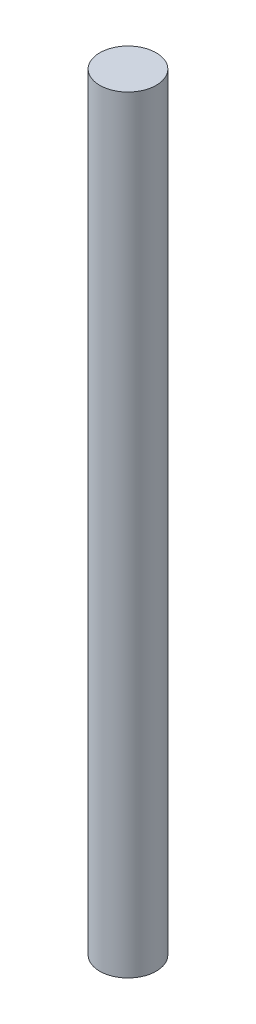
ISO-10303-21;
HEADER;
FILE_DESCRIPTION(('STEP AP214'),'2;1');
FILE_NAME('part.step','',(''),(''),'','','');
FILE_SCHEMA(('AUTOMOTIVE_DESIGN { 1 0 10303 214 1 1 1 1 }'));
ENDSEC;
DATA;
#1=APPLICATION_CONTEXT('core data for automotive mechanical design processes');
#2=APPLICATION_PROTOCOL_DEFINITION('international standard','automotive_design',2000,#1);
#3=PRODUCT_CONTEXT('',#1,'mechanical');
#4=PRODUCT('Part','Part','',(#3));
#5=PRODUCT_RELATED_PRODUCT_CATEGORY('part','',(#4));
#6=PRODUCT_DEFINITION_FORMATION('','',#4);
#7=PRODUCT_DEFINITION_CONTEXT('part definition',#1,'design');
#8=PRODUCT_DEFINITION('design','',#6,#7);
#9=PRODUCT_DEFINITION_SHAPE('','',#8);
#10=(LENGTH_UNIT() NAMED_UNIT(*) SI_UNIT(.MILLI.,.METRE.));
#11=(NAMED_UNIT(*) PLANE_ANGLE_UNIT() SI_UNIT($,.RADIAN.));
#12=(NAMED_UNIT(*) SI_UNIT($,.STERADIAN.) SOLID_ANGLE_UNIT());
#13=UNCERTAINTY_MEASURE_WITH_UNIT(LENGTH_MEASURE(1.E-05),#10,'distance_accuracy_value','');
#14=(GEOMETRIC_REPRESENTATION_CONTEXT(3) GLOBAL_UNCERTAINTY_ASSIGNED_CONTEXT((#13)) GLOBAL_UNIT_ASSIGNED_CONTEXT((#10,
#11,#12)) REPRESENTATION_CONTEXT('',''));
#15=CARTESIAN_POINT('',(0.,0.,0.));
#16=DIRECTION('',(0.,0.,1.));
#17=DIRECTION('',(1.,0.,0.));
#18=AXIS2_PLACEMENT_3D('',#15,#16,#17);
#19=CARTESIAN_POINT('',(0.,64.77,0.));
#20=DIRECTION('',(0.,-1.,0.));
#21=DIRECTION('',(0.,0.,-1.));
#22=AXIS2_PLACEMENT_3D('',#19,#20,#21);
#23=CYLINDRICAL_SURFACE('',#22,2.38125);
#24=CARTESIAN_POINT('',(0.,64.77,0.));
#25=DIRECTION('',(0.,1.,0.));
#26=DIRECTION('',(0.,0.,1.));
#27=AXIS2_PLACEMENT_3D('',#24,#25,#26);
#28=CIRCLE('',#27,2.38125);
#29=CARTESIAN_POINT('',(0.,64.77,2.38125));
#30=VERTEX_POINT('',#29);
#31=EDGE_CURVE('E10',#30,#30,#28,.T.);
#32=ORIENTED_EDGE('',*,*,#31,.F.);
#33=EDGE_LOOP('',(#32));
#34=FACE_BOUND('',#33,.T.);
#35=CARTESIAN_POINT('',(0.,0.,0.));
#36=DIRECTION('',(0.,1.,0.));
#37=DIRECTION('',(0.,0.,1.));
#38=AXIS2_PLACEMENT_3D('',#35,#36,#37);
#39=CIRCLE('',#38,2.38125);
#40=CARTESIAN_POINT('',(0.,0.,2.38125));
#41=VERTEX_POINT('',#40);
#42=EDGE_CURVE('E40',#41,#41,#39,.T.);
#43=ORIENTED_EDGE('',*,*,#42,.T.);
#44=EDGE_LOOP('',(#43));
#45=FACE_BOUND('',#44,.T.);
#46=ADVANCED_FACE('F37',(#34,#45),#23,.T.);
#47=CARTESIAN_POINT('',(0.,64.77,0.));
#48=DIRECTION('',(0.,1.,0.));
#49=DIRECTION('',(0.,0.,1.));
#50=AXIS2_PLACEMENT_3D('',#47,#48,#49);
#51=PLANE('',#50);
#52=ORIENTED_EDGE('',*,*,#31,.T.);
#53=EDGE_LOOP('',(#52));
#54=FACE_BOUND('',#53,.T.);
#55=ADVANCED_FACE('F54',(#54),#51,.T.);
#56=CARTESIAN_POINT('',(0.,0.,0.));
#57=DIRECTION('',(0.,1.,0.));
#58=DIRECTION('',(0.,0.,1.));
#59=AXIS2_PLACEMENT_3D('',#56,#57,#58);
#60=PLANE('',#59);
#61=ORIENTED_EDGE('',*,*,#42,.F.);
#62=EDGE_LOOP('',(#61));
#63=FACE_BOUND('',#62,.T.);
#64=ADVANCED_FACE('F52',(#63),#60,.F.);
#65=CLOSED_SHELL('',(#46,#55,#64));
#66=MANIFOLD_SOLID_BREP('B2',#65);
#67=ADVANCED_BREP_SHAPE_REPRESENTATION('',(#18,#66),#14);
#68=SHAPE_DEFINITION_REPRESENTATION(#9,#67);
ENDSEC;
END-ISO-10303-21;
